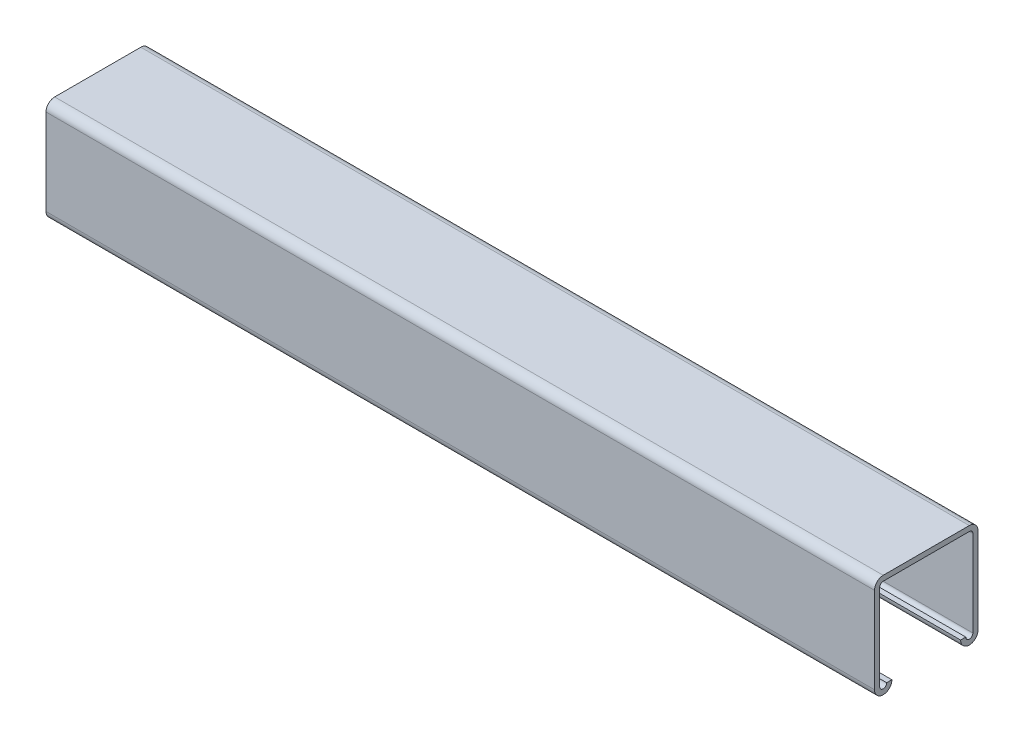
ISO-10303-21;
HEADER;
FILE_DESCRIPTION(('STEP AP214'),'2;1');
FILE_NAME('part.step','',(''),(''),'','','');
FILE_SCHEMA(('AUTOMOTIVE_DESIGN { 1 0 10303 214 1 1 1 1 }'));
ENDSEC;
DATA;
#1=APPLICATION_CONTEXT('core data for automotive mechanical design processes');
#2=APPLICATION_PROTOCOL_DEFINITION('international standard','automotive_design',2000,#1);
#3=PRODUCT_CONTEXT('',#1,'mechanical');
#4=PRODUCT('Part','Part','',(#3));
#5=PRODUCT_RELATED_PRODUCT_CATEGORY('part','',(#4));
#6=PRODUCT_DEFINITION_FORMATION('','',#4);
#7=PRODUCT_DEFINITION_CONTEXT('part definition',#1,'design');
#8=PRODUCT_DEFINITION('design','',#6,#7);
#9=PRODUCT_DEFINITION_SHAPE('','',#8);
#10=(LENGTH_UNIT() NAMED_UNIT(*) SI_UNIT(.MILLI.,.METRE.));
#11=(NAMED_UNIT(*) PLANE_ANGLE_UNIT() SI_UNIT($,.RADIAN.));
#12=(NAMED_UNIT(*) SI_UNIT($,.STERADIAN.) SOLID_ANGLE_UNIT());
#13=UNCERTAINTY_MEASURE_WITH_UNIT(LENGTH_MEASURE(1.E-05),#10,'distance_accuracy_value','');
#14=(GEOMETRIC_REPRESENTATION_CONTEXT(3) GLOBAL_UNCERTAINTY_ASSIGNED_CONTEXT((#13)) GLOBAL_UNIT_ASSIGNED_CONTEXT((#10,
#11,#12)) REPRESENTATION_CONTEXT('',''));
#15=CARTESIAN_POINT('',(0.,0.,0.));
#16=DIRECTION('',(0.,0.,1.));
#17=DIRECTION('',(1.,0.,0.));
#18=AXIS2_PLACEMENT_3D('',#15,#16,#17);
#19=CARTESIAN_POINT('',(305.,-34.9,-15.85));
#20=DIRECTION('',(-1.,0.,0.));
#21=DIRECTION('',(0.,0.,1.));
#22=AXIS2_PLACEMENT_3D('',#19,#20,#21);
#23=CYLINDRICAL_SURFACE('',#22,1.3);
#24=CARTESIAN_POINT('',(0.,-34.9,-15.85));
#25=DIRECTION('',(1.,0.,0.));
#26=DIRECTION('',(0.,0.,1.));
#27=AXIS2_PLACEMENT_3D('',#24,#25,#26);
#28=CIRCLE('',#27,1.3);
#29=CARTESIAN_POINT('',(0.,-34.9,-17.15));
#30=VERTEX_POINT('',#29);
#31=CARTESIAN_POINT('',(0.,-34.9,-14.55));
#32=VERTEX_POINT('',#31);
#33=EDGE_CURVE('E176',#30,#32,#28,.F.);
#34=ORIENTED_EDGE('',*,*,#33,.T.);
#35=DIRECTION('',(-1.,0.,0.));
#36=VECTOR('',#35,1.);
#37=CARTESIAN_POINT('',(305.,-34.9,-14.55));
#38=LINE('',#37,#36);
#39=CARTESIAN_POINT('',(305.,-34.9,-14.55));
#40=VERTEX_POINT('',#39);
#41=EDGE_CURVE('E11',#40,#32,#38,.T.);
#42=ORIENTED_EDGE('',*,*,#41,.F.);
#43=CARTESIAN_POINT('',(305.,-34.9,-15.85));
#44=DIRECTION('',(1.,0.,0.));
#45=DIRECTION('',(0.,0.,1.));
#46=AXIS2_PLACEMENT_3D('',#43,#44,#45);
#47=CIRCLE('',#46,1.3);
#48=CARTESIAN_POINT('',(305.,-34.9,-17.15));
#49=VERTEX_POINT('',#48);
#50=EDGE_CURVE('E113',#49,#40,#47,.F.);
#51=ORIENTED_EDGE('',*,*,#50,.F.);
#52=DIRECTION('',(-1.,0.,0.));
#53=VECTOR('',#52,1.);
#54=CARTESIAN_POINT('',(305.,-34.9,-17.15));
#55=LINE('',#54,#53);
#56=EDGE_CURVE('E172',#49,#30,#55,.T.);
#57=ORIENTED_EDGE('',*,*,#56,.T.);
#58=EDGE_LOOP('',(#34,#42,#51,#57));
#59=FACE_BOUND('',#58,.T.);
#60=ADVANCED_FACE('F33',(#59),#23,.F.);
#61=CARTESIAN_POINT('',(305.,-34.9,-12.65));
#62=DIRECTION('',(0.,1.,0.));
#63=DIRECTION('',(0.,0.,1.));
#64=AXIS2_PLACEMENT_3D('',#61,#62,#63);
#65=PLANE('',#64);
#66=DIRECTION('',(0.,0.,-1.));
#67=VECTOR('',#66,1.);
#68=CARTESIAN_POINT('',(0.,-34.9,-12.65));
#69=LINE('',#68,#67);
#70=CARTESIAN_POINT('',(0.,-34.9,-12.65));
#71=VERTEX_POINT('',#70);
#72=EDGE_CURVE('E179',#71,#32,#69,.T.);
#73=ORIENTED_EDGE('',*,*,#72,.F.);
#74=DIRECTION('',(-1.,0.,0.));
#75=VECTOR('',#74,1.);
#76=CARTESIAN_POINT('',(305.,-34.9,-12.65));
#77=LINE('',#76,#75);
#78=CARTESIAN_POINT('',(305.,-34.9,-12.65));
#79=VERTEX_POINT('',#78);
#80=EDGE_CURVE('E41',#79,#71,#77,.T.);
#81=ORIENTED_EDGE('',*,*,#80,.F.);
#82=DIRECTION('',(0.,0.,-1.));
#83=VECTOR('',#82,1.);
#84=CARTESIAN_POINT('',(305.,-34.9,-12.65));
#85=LINE('',#84,#83);
#86=EDGE_CURVE('E261',#79,#40,#85,.T.);
#87=ORIENTED_EDGE('',*,*,#86,.T.);
#88=ORIENTED_EDGE('',*,*,#41,.T.);
#89=EDGE_LOOP('',(#73,#81,#87,#88));
#90=FACE_BOUND('',#89,.T.);
#91=ADVANCED_FACE('F248',(#90),#65,.T.);
#92=CARTESIAN_POINT('',(305.,-34.9,-15.85));
#93=DIRECTION('',(-1.,0.,0.));
#94=DIRECTION('',(0.,0.,1.));
#95=AXIS2_PLACEMENT_3D('',#92,#93,#94);
#96=CYLINDRICAL_SURFACE('',#95,3.2);
#97=CARTESIAN_POINT('',(0.,-34.9,-15.85));
#98=DIRECTION('',(-1.,0.,0.));
#99=DIRECTION('',(0.,0.,1.));
#100=AXIS2_PLACEMENT_3D('',#97,#98,#99);
#101=CIRCLE('',#100,3.2);
#102=CARTESIAN_POINT('',(0.,-34.9,-19.05));
#103=VERTEX_POINT('',#102);
#104=EDGE_CURVE('E182',#103,#71,#101,.T.);
#105=ORIENTED_EDGE('',*,*,#104,.F.);
#106=DIRECTION('',(-1.,0.,0.));
#107=VECTOR('',#106,1.);
#108=CARTESIAN_POINT('',(305.,-34.9,-19.05));
#109=LINE('',#108,#107);
#110=CARTESIAN_POINT('',(305.,-34.9,-19.05));
#111=VERTEX_POINT('',#110);
#112=EDGE_CURVE('E238',#111,#103,#109,.T.);
#113=ORIENTED_EDGE('',*,*,#112,.F.);
#114=CARTESIAN_POINT('',(305.,-34.9,-15.85));
#115=DIRECTION('',(-1.,0.,0.));
#116=DIRECTION('',(0.,0.,1.));
#117=AXIS2_PLACEMENT_3D('',#114,#115,#116);
#118=CIRCLE('',#117,3.2);
#119=EDGE_CURVE('E245',#111,#79,#118,.T.);
#120=ORIENTED_EDGE('',*,*,#119,.T.);
#121=ORIENTED_EDGE('',*,*,#80,.T.);
#122=EDGE_LOOP('',(#105,#113,#120,#121));
#123=FACE_BOUND('',#122,.T.);
#124=ADVANCED_FACE('F243',(#123),#96,.T.);
#125=CARTESIAN_POINT('',(305.,-3.2,-19.05));
#126=DIRECTION('',(0.,0.,-1.));
#127=DIRECTION('',(0.,1.,0.));
#128=AXIS2_PLACEMENT_3D('',#125,#126,#127);
#129=PLANE('',#128);
#130=DIRECTION('',(0.,-1.,0.));
#131=VECTOR('',#130,1.);
#132=CARTESIAN_POINT('',(0.,-3.2,-19.05));
#133=LINE('',#132,#131);
#134=CARTESIAN_POINT('',(0.,-3.2,-19.0499999999999));
#135=VERTEX_POINT('',#134);
#136=EDGE_CURVE('E185',#135,#103,#133,.T.);
#137=ORIENTED_EDGE('',*,*,#136,.F.);
#138=DIRECTION('',(-1.,0.,0.));
#139=VECTOR('',#138,1.);
#140=CARTESIAN_POINT('',(305.,-3.2,-19.0499999999999));
#141=LINE('',#140,#139);
#142=CARTESIAN_POINT('',(305.,-3.2,-19.0499999999999));
#143=VERTEX_POINT('',#142);
#144=EDGE_CURVE('E236',#143,#135,#141,.T.);
#145=ORIENTED_EDGE('',*,*,#144,.F.);
#146=DIRECTION('',(0.,-1.,0.));
#147=VECTOR('',#146,1.);
#148=CARTESIAN_POINT('',(305.,-3.2,-19.05));
#149=LINE('',#148,#147);
#150=EDGE_CURVE('E258',#143,#111,#149,.T.);
#151=ORIENTED_EDGE('',*,*,#150,.T.);
#152=ORIENTED_EDGE('',*,*,#112,.T.);
#153=EDGE_LOOP('',(#137,#145,#151,#152));
#154=FACE_BOUND('',#153,.T.);
#155=ADVANCED_FACE('F255',(#154),#129,.T.);
#156=CARTESIAN_POINT('',(305.,-3.2,-15.8499999999997));
#157=DIRECTION('',(-1.,0.,0.));
#158=DIRECTION('',(0.,0.,1.));
#159=AXIS2_PLACEMENT_3D('',#156,#157,#158);
#160=CYLINDRICAL_SURFACE('',#159,3.20000000000014);
#161=CARTESIAN_POINT('',(0.,-3.2,-15.8499999999997));
#162=DIRECTION('',(-1.,0.,0.));
#163=DIRECTION('',(0.,0.,1.));
#164=AXIS2_PLACEMENT_3D('',#161,#162,#163);
#165=CIRCLE('',#164,3.20000000000014);
#166=CARTESIAN_POINT('',(0.,0.,-15.8499999999997));
#167=VERTEX_POINT('',#166);
#168=EDGE_CURVE('E188',#167,#135,#165,.T.);
#169=ORIENTED_EDGE('',*,*,#168,.F.);
#170=DIRECTION('',(-1.,0.,0.));
#171=VECTOR('',#170,1.);
#172=CARTESIAN_POINT('',(305.,0.,-15.8499999999997));
#173=LINE('',#172,#171);
#174=CARTESIAN_POINT('',(305.,0.,-15.8499999999997));
#175=VERTEX_POINT('',#174);
#176=EDGE_CURVE('E234',#175,#167,#173,.T.);
#177=ORIENTED_EDGE('',*,*,#176,.F.);
#178=CARTESIAN_POINT('',(305.,-3.2,-15.8499999999997));
#179=DIRECTION('',(-1.,0.,0.));
#180=DIRECTION('',(0.,0.,1.));
#181=AXIS2_PLACEMENT_3D('',#178,#179,#180);
#182=CIRCLE('',#181,3.20000000000014);
#183=EDGE_CURVE('E263',#175,#143,#182,.T.);
#184=ORIENTED_EDGE('',*,*,#183,.T.);
#185=ORIENTED_EDGE('',*,*,#144,.T.);
#186=EDGE_LOOP('',(#169,#177,#184,#185));
#187=FACE_BOUND('',#186,.T.);
#188=ADVANCED_FACE('F320',(#187),#160,.T.);
#189=CARTESIAN_POINT('',(305.,0.,-15.8499999999997));
#190=DIRECTION('',(0.,1.,0.));
#191=DIRECTION('',(0.,0.,1.));
#192=AXIS2_PLACEMENT_3D('',#189,#190,#191);
#193=PLANE('',#192);
#194=DIRECTION('',(0.,0.,-1.));
#195=VECTOR('',#194,1.);
#196=CARTESIAN_POINT('',(0.,0.,-15.8499999999997));
#197=LINE('',#196,#195);
#198=CARTESIAN_POINT('',(0.,1.31838984174237E-13,15.85));
#199=VERTEX_POINT('',#198);
#200=EDGE_CURVE('E191',#199,#167,#197,.T.);
#201=ORIENTED_EDGE('',*,*,#200,.F.);
#202=DIRECTION('',(-1.,0.,0.));
#203=VECTOR('',#202,1.);
#204=CARTESIAN_POINT('',(305.,1.31838984174237E-13,15.85));
#205=LINE('',#204,#203);
#206=CARTESIAN_POINT('',(305.,1.31838984174237E-13,15.85));
#207=VERTEX_POINT('',#206);
#208=EDGE_CURVE('E232',#207,#199,#205,.T.);
#209=ORIENTED_EDGE('',*,*,#208,.F.);
#210=DIRECTION('',(0.,0.,-1.));
#211=VECTOR('',#210,1.);
#212=CARTESIAN_POINT('',(305.,0.,-15.8499999999997));
#213=LINE('',#212,#211);
#214=EDGE_CURVE('E269',#207,#175,#213,.T.);
#215=ORIENTED_EDGE('',*,*,#214,.T.);
#216=ORIENTED_EDGE('',*,*,#176,.T.);
#217=EDGE_LOOP('',(#201,#209,#215,#216));
#218=FACE_BOUND('',#217,.T.);
#219=ADVANCED_FACE('F323',(#218),#193,.T.);
#220=CARTESIAN_POINT('',(305.,-3.2,15.85));
#221=DIRECTION('',(-1.,0.,0.));
#222=DIRECTION('',(0.,0.,1.));
#223=AXIS2_PLACEMENT_3D('',#220,#221,#222);
#224=CYLINDRICAL_SURFACE('',#223,3.20000000000014);
#225=CARTESIAN_POINT('',(0.,-3.2,15.85));
#226=DIRECTION('',(-1.,0.,0.));
#227=DIRECTION('',(0.,0.,-1.));
#228=AXIS2_PLACEMENT_3D('',#225,#226,#227);
#229=CIRCLE('',#228,3.20000000000014);
#230=CARTESIAN_POINT('',(0.,-3.2,19.0500000000003));
#231=VERTEX_POINT('',#230);
#232=EDGE_CURVE('E194',#231,#199,#229,.T.);
#233=ORIENTED_EDGE('',*,*,#232,.F.);
#234=DIRECTION('',(-1.,0.,0.));
#235=VECTOR('',#234,1.);
#236=CARTESIAN_POINT('',(305.,-3.2,19.0500000000003));
#237=LINE('',#236,#235);
#238=CARTESIAN_POINT('',(305.,-3.2,19.0500000000003));
#239=VERTEX_POINT('',#238);
#240=EDGE_CURVE('E230',#239,#231,#237,.T.);
#241=ORIENTED_EDGE('',*,*,#240,.F.);
#242=CARTESIAN_POINT('',(305.,-3.2,15.85));
#243=DIRECTION('',(-1.,0.,0.));
#244=DIRECTION('',(0.,0.,-1.));
#245=AXIS2_PLACEMENT_3D('',#242,#243,#244);
#246=CIRCLE('',#245,3.20000000000014);
#247=EDGE_CURVE('E272',#239,#207,#246,.T.);
#248=ORIENTED_EDGE('',*,*,#247,.T.);
#249=ORIENTED_EDGE('',*,*,#208,.T.);
#250=EDGE_LOOP('',(#233,#241,#248,#249));
#251=FACE_BOUND('',#250,.T.);
#252=ADVANCED_FACE('F327',(#251),#224,.T.);
#253=CARTESIAN_POINT('',(305.,-3.2,19.0500000000003));
#254=DIRECTION('',(0.,0.,1.));
#255=DIRECTION('',(0.,-1.,0.));
#256=AXIS2_PLACEMENT_3D('',#253,#254,#255);
#257=PLANE('',#256);
#258=DIRECTION('',(0.,1.,0.));
#259=VECTOR('',#258,1.);
#260=CARTESIAN_POINT('',(0.,-3.2,19.0500000000003));
#261=LINE('',#260,#259);
#262=CARTESIAN_POINT('',(0.,-34.9,19.0500000000001));
#263=VERTEX_POINT('',#262);
#264=EDGE_CURVE('E197',#263,#231,#261,.T.);
#265=ORIENTED_EDGE('',*,*,#264,.F.);
#266=DIRECTION('',(-1.,0.,0.));
#267=VECTOR('',#266,1.);
#268=CARTESIAN_POINT('',(305.,-34.9,19.0500000000001));
#269=LINE('',#268,#267);
#270=CARTESIAN_POINT('',(305.,-34.9,19.0500000000001));
#271=VERTEX_POINT('',#270);
#272=EDGE_CURVE('E228',#271,#263,#269,.T.);
#273=ORIENTED_EDGE('',*,*,#272,.F.);
#274=DIRECTION('',(0.,1.,0.));
#275=VECTOR('',#274,1.);
#276=CARTESIAN_POINT('',(305.,-3.2,19.0500000000003));
#277=LINE('',#276,#275);
#278=EDGE_CURVE('E275',#271,#239,#277,.T.);
#279=ORIENTED_EDGE('',*,*,#278,.T.);
#280=ORIENTED_EDGE('',*,*,#240,.T.);
#281=EDGE_LOOP('',(#265,#273,#279,#280));
#282=FACE_BOUND('',#281,.T.);
#283=ADVANCED_FACE('F331',(#282),#257,.T.);
#284=CARTESIAN_POINT('',(305.,-34.9,15.85));
#285=DIRECTION('',(-1.,0.,0.));
#286=DIRECTION('',(0.,0.,1.));
#287=AXIS2_PLACEMENT_3D('',#284,#285,#286);
#288=CYLINDRICAL_SURFACE('',#287,3.20000000000014);
#289=CARTESIAN_POINT('',(0.,-34.9,15.85));
#290=DIRECTION('',(-1.,0.,0.));
#291=DIRECTION('',(0.,0.,-1.));
#292=AXIS2_PLACEMENT_3D('',#289,#290,#291);
#293=CIRCLE('',#292,3.20000000000014);
#294=CARTESIAN_POINT('',(0.,-34.9,12.6499999999999));
#295=VERTEX_POINT('',#294);
#296=EDGE_CURVE('E200',#295,#263,#293,.T.);
#297=ORIENTED_EDGE('',*,*,#296,.F.);
#298=DIRECTION('',(-1.,0.,0.));
#299=VECTOR('',#298,1.);
#300=CARTESIAN_POINT('',(305.,-34.9,12.6499999999999));
#301=LINE('',#300,#299);
#302=CARTESIAN_POINT('',(305.,-34.9,12.6499999999999));
#303=VERTEX_POINT('',#302);
#304=EDGE_CURVE('E226',#303,#295,#301,.T.);
#305=ORIENTED_EDGE('',*,*,#304,.F.);
#306=CARTESIAN_POINT('',(305.,-34.9,15.85));
#307=DIRECTION('',(-1.,0.,0.));
#308=DIRECTION('',(0.,0.,-1.));
#309=AXIS2_PLACEMENT_3D('',#306,#307,#308);
#310=CIRCLE('',#309,3.20000000000014);
#311=EDGE_CURVE('E278',#303,#271,#310,.T.);
#312=ORIENTED_EDGE('',*,*,#311,.T.);
#313=ORIENTED_EDGE('',*,*,#272,.T.);
#314=EDGE_LOOP('',(#297,#305,#312,#313));
#315=FACE_BOUND('',#314,.T.);
#316=ADVANCED_FACE('F335',(#315),#288,.T.);
#317=CARTESIAN_POINT('',(305.,-34.9,14.5499999999999));
#318=DIRECTION('',(0.,1.,0.));
#319=DIRECTION('',(0.,0.,1.));
#320=AXIS2_PLACEMENT_3D('',#317,#318,#319);
#321=PLANE('',#320);
#322=DIRECTION('',(0.,0.,-1.));
#323=VECTOR('',#322,1.);
#324=CARTESIAN_POINT('',(0.,-34.9,14.5499999999999));
#325=LINE('',#324,#323);
#326=CARTESIAN_POINT('',(0.,-34.9,14.5499999999999));
#327=VERTEX_POINT('',#326);
#328=EDGE_CURVE('E203',#327,#295,#325,.T.);
#329=ORIENTED_EDGE('',*,*,#328,.F.);
#330=DIRECTION('',(-1.,0.,0.));
#331=VECTOR('',#330,1.);
#332=CARTESIAN_POINT('',(305.,-34.9,14.5499999999999));
#333=LINE('',#332,#331);
#334=CARTESIAN_POINT('',(305.,-34.9,14.5499999999999));
#335=VERTEX_POINT('',#334);
#336=EDGE_CURVE('E224',#335,#327,#333,.T.);
#337=ORIENTED_EDGE('',*,*,#336,.F.);
#338=DIRECTION('',(0.,0.,-1.));
#339=VECTOR('',#338,1.);
#340=CARTESIAN_POINT('',(305.,-34.9,14.5499999999999));
#341=LINE('',#340,#339);
#342=EDGE_CURVE('E281',#335,#303,#341,.T.);
#343=ORIENTED_EDGE('',*,*,#342,.T.);
#344=ORIENTED_EDGE('',*,*,#304,.T.);
#345=EDGE_LOOP('',(#329,#337,#343,#344));
#346=FACE_BOUND('',#345,.T.);
#347=ADVANCED_FACE('F339',(#346),#321,.T.);
#348=CARTESIAN_POINT('',(305.,-34.9,15.85));
#349=DIRECTION('',(-1.,0.,0.));
#350=DIRECTION('',(0.,0.,1.));
#351=AXIS2_PLACEMENT_3D('',#348,#349,#350);
#352=CYLINDRICAL_SURFACE('',#351,1.30000000000014);
#353=CARTESIAN_POINT('',(0.,-34.9,15.85));
#354=DIRECTION('',(1.,0.,0.));
#355=DIRECTION('',(0.,0.,1.));
#356=AXIS2_PLACEMENT_3D('',#353,#354,#355);
#357=CIRCLE('',#356,1.30000000000014);
#358=CARTESIAN_POINT('',(0.,-34.9,17.1500000000003));
#359=VERTEX_POINT('',#358);
#360=EDGE_CURVE('E206',#327,#359,#357,.F.);
#361=ORIENTED_EDGE('',*,*,#360,.T.);
#362=DIRECTION('',(-1.,0.,0.));
#363=VECTOR('',#362,1.);
#364=CARTESIAN_POINT('',(305.,-34.9,17.1500000000003));
#365=LINE('',#364,#363);
#366=CARTESIAN_POINT('',(305.,-34.9,17.1500000000003));
#367=VERTEX_POINT('',#366);
#368=EDGE_CURVE('E221',#367,#359,#365,.T.);
#369=ORIENTED_EDGE('',*,*,#368,.F.);
#370=CARTESIAN_POINT('',(305.,-34.9,15.85));
#371=DIRECTION('',(1.,0.,0.));
#372=DIRECTION('',(0.,0.,1.));
#373=AXIS2_PLACEMENT_3D('',#370,#371,#372);
#374=CIRCLE('',#373,1.30000000000014);
#375=EDGE_CURVE('E284',#335,#367,#374,.F.);
#376=ORIENTED_EDGE('',*,*,#375,.F.);
#377=ORIENTED_EDGE('',*,*,#336,.T.);
#378=EDGE_LOOP('',(#361,#369,#376,#377));
#379=FACE_BOUND('',#378,.T.);
#380=ADVANCED_FACE('F343',(#379),#352,.F.);
#381=CARTESIAN_POINT('',(305.,-3.2,17.1500000000003));
#382=DIRECTION('',(0.,0.,1.));
#383=DIRECTION('',(0.,-1.,0.));
#384=AXIS2_PLACEMENT_3D('',#381,#382,#383);
#385=PLANE('',#384);
#386=DIRECTION('',(0.,1.,0.));
#387=VECTOR('',#386,1.);
#388=CARTESIAN_POINT('',(0.,-3.2,17.1500000000003));
#389=LINE('',#388,#387);
#390=CARTESIAN_POINT('',(0.,-3.2,17.1500000000001));
#391=VERTEX_POINT('',#390);
#392=EDGE_CURVE('E208',#359,#391,#389,.T.);
#393=ORIENTED_EDGE('',*,*,#392,.T.);
#394=DIRECTION('',(-1.,0.,0.));
#395=VECTOR('',#394,1.);
#396=CARTESIAN_POINT('',(305.,-3.2,17.1500000000001));
#397=LINE('',#396,#395);
#398=CARTESIAN_POINT('',(305.,-3.2,17.1500000000001));
#399=VERTEX_POINT('',#398);
#400=EDGE_CURVE('E218',#399,#391,#397,.T.);
#401=ORIENTED_EDGE('',*,*,#400,.F.);
#402=DIRECTION('',(0.,1.,0.));
#403=VECTOR('',#402,1.);
#404=CARTESIAN_POINT('',(305.,-3.2,17.1500000000003));
#405=LINE('',#404,#403);
#406=EDGE_CURVE('E286',#367,#399,#405,.T.);
#407=ORIENTED_EDGE('',*,*,#406,.F.);
#408=ORIENTED_EDGE('',*,*,#368,.T.);
#409=EDGE_LOOP('',(#393,#401,#407,#408));
#410=FACE_BOUND('',#409,.T.);
#411=ADVANCED_FACE('F293',(#410),#385,.F.);
#412=CARTESIAN_POINT('',(305.,-3.2,15.85));
#413=DIRECTION('',(-1.,0.,0.));
#414=DIRECTION('',(0.,0.,1.));
#415=AXIS2_PLACEMENT_3D('',#412,#413,#414);
#416=CYLINDRICAL_SURFACE('',#415,1.30000000000014);
#417=CARTESIAN_POINT('',(0.,-3.2,15.85));
#418=DIRECTION('',(1.,0.,0.));
#419=DIRECTION('',(0.,0.,1.));
#420=AXIS2_PLACEMENT_3D('',#417,#418,#419);
#421=CIRCLE('',#420,1.30000000000014);
#422=CARTESIAN_POINT('',(0.,-1.9,15.85));
#423=VERTEX_POINT('',#422);
#424=EDGE_CURVE('E210',#391,#423,#421,.F.);
#425=ORIENTED_EDGE('',*,*,#424,.T.);
#426=DIRECTION('',(-1.,0.,0.));
#427=VECTOR('',#426,1.);
#428=CARTESIAN_POINT('',(305.,-1.9,15.85));
#429=LINE('',#428,#427);
#430=CARTESIAN_POINT('',(305.,-1.9,15.85));
#431=VERTEX_POINT('',#430);
#432=EDGE_CURVE('E167',#431,#423,#429,.T.);
#433=ORIENTED_EDGE('',*,*,#432,.F.);
#434=CARTESIAN_POINT('',(305.,-3.2,15.85));
#435=DIRECTION('',(1.,0.,0.));
#436=DIRECTION('',(0.,0.,1.));
#437=AXIS2_PLACEMENT_3D('',#434,#435,#436);
#438=CIRCLE('',#437,1.30000000000014);
#439=EDGE_CURVE('E158',#399,#431,#438,.F.);
#440=ORIENTED_EDGE('',*,*,#439,.F.);
#441=ORIENTED_EDGE('',*,*,#400,.T.);
#442=EDGE_LOOP('',(#425,#433,#440,#441));
#443=FACE_BOUND('',#442,.T.);
#444=ADVANCED_FACE('F297',(#443),#416,.F.);
#445=CARTESIAN_POINT('',(305.,-1.9,-15.8499999999997));
#446=DIRECTION('',(0.,1.,0.));
#447=DIRECTION('',(0.,0.,1.));
#448=AXIS2_PLACEMENT_3D('',#445,#446,#447);
#449=PLANE('',#448);
#450=DIRECTION('',(0.,0.,1.));
#451=VECTOR('',#450,1.);
#452=CARTESIAN_POINT('',(0.,-1.9,-15.8499999999997));
#453=LINE('',#452,#451);
#454=CARTESIAN_POINT('',(0.,-1.89999999999987,-15.8499999999997));
#455=VERTEX_POINT('',#454);
#456=EDGE_CURVE('E166',#423,#455,#453,.F.);
#457=ORIENTED_EDGE('',*,*,#456,.T.);
#458=DIRECTION('',(-1.,0.,0.));
#459=VECTOR('',#458,1.);
#460=CARTESIAN_POINT('',(305.,-1.89999999999987,-15.8499999999997));
#461=LINE('',#460,#459);
#462=CARTESIAN_POINT('',(305.,-1.89999999999987,-15.8499999999997));
#463=VERTEX_POINT('',#462);
#464=EDGE_CURVE('E163',#463,#455,#461,.T.);
#465=ORIENTED_EDGE('',*,*,#464,.F.);
#466=DIRECTION('',(0.,0.,1.));
#467=VECTOR('',#466,1.);
#468=CARTESIAN_POINT('',(305.,-1.9,-15.8499999999997));
#469=LINE('',#468,#467);
#470=EDGE_CURVE('E152',#431,#463,#469,.F.);
#471=ORIENTED_EDGE('',*,*,#470,.F.);
#472=ORIENTED_EDGE('',*,*,#432,.T.);
#473=EDGE_LOOP('',(#457,#465,#471,#472));
#474=FACE_BOUND('',#473,.T.);
#475=ADVANCED_FACE('F164',(#474),#449,.F.);
#476=CARTESIAN_POINT('',(305.,-3.2,-15.8499999999997));
#477=DIRECTION('',(-1.,0.,0.));
#478=DIRECTION('',(0.,0.,1.));
#479=AXIS2_PLACEMENT_3D('',#476,#477,#478);
#480=CYLINDRICAL_SURFACE('',#479,1.30000000000014);
#481=CARTESIAN_POINT('',(0.,-3.2,-15.8499999999997));
#482=DIRECTION('',(1.,0.,0.));
#483=DIRECTION('',(0.,0.,1.));
#484=AXIS2_PLACEMENT_3D('',#481,#482,#483);
#485=CIRCLE('',#484,1.30000000000014);
#486=CARTESIAN_POINT('',(0.,-3.2,-17.15));
#487=VERTEX_POINT('',#486);
#488=EDGE_CURVE('E101',#455,#487,#485,.F.);
#489=ORIENTED_EDGE('',*,*,#488,.T.);
#490=DIRECTION('',(-1.,0.,0.));
#491=VECTOR('',#490,1.);
#492=CARTESIAN_POINT('',(305.,-3.2,-17.15));
#493=LINE('',#492,#491);
#494=CARTESIAN_POINT('',(305.,-3.2,-17.15));
#495=VERTEX_POINT('',#494);
#496=EDGE_CURVE('E168',#495,#487,#493,.T.);
#497=ORIENTED_EDGE('',*,*,#496,.F.);
#498=CARTESIAN_POINT('',(305.,-3.2,-15.8499999999997));
#499=DIRECTION('',(1.,0.,0.));
#500=DIRECTION('',(0.,0.,1.));
#501=AXIS2_PLACEMENT_3D('',#498,#499,#500);
#502=CIRCLE('',#501,1.30000000000014);
#503=EDGE_CURVE('E156',#463,#495,#502,.F.);
#504=ORIENTED_EDGE('',*,*,#503,.F.);
#505=ORIENTED_EDGE('',*,*,#464,.T.);
#506=EDGE_LOOP('',(#489,#497,#504,#505));
#507=FACE_BOUND('',#506,.T.);
#508=ADVANCED_FACE('F170',(#507),#480,.F.);
#509=CARTESIAN_POINT('',(305.,-3.2,-17.15));
#510=DIRECTION('',(0.,0.,-1.));
#511=DIRECTION('',(0.,1.,0.));
#512=AXIS2_PLACEMENT_3D('',#509,#510,#511);
#513=PLANE('',#512);
#514=DIRECTION('',(0.,-1.,0.));
#515=VECTOR('',#514,1.);
#516=CARTESIAN_POINT('',(0.,-3.2,-17.15));
#517=LINE('',#516,#515);
#518=EDGE_CURVE('E107',#487,#30,#517,.T.);
#519=ORIENTED_EDGE('',*,*,#518,.T.);
#520=ORIENTED_EDGE('',*,*,#56,.F.);
#521=DIRECTION('',(0.,-1.,0.));
#522=VECTOR('',#521,1.);
#523=CARTESIAN_POINT('',(305.,-3.2,-17.15));
#524=LINE('',#523,#522);
#525=EDGE_CURVE('E49',#495,#49,#524,.T.);
#526=ORIENTED_EDGE('',*,*,#525,.F.);
#527=ORIENTED_EDGE('',*,*,#496,.T.);
#528=EDGE_LOOP('',(#519,#520,#526,#527));
#529=FACE_BOUND('',#528,.T.);
#530=ADVANCED_FACE('F299',(#529),#513,.F.);
#531=CARTESIAN_POINT('',(305.,-34.9,-15.85));
#532=DIRECTION('',(1.,0.,0.));
#533=DIRECTION('',(0.,0.,1.));
#534=AXIS2_PLACEMENT_3D('',#531,#532,#533);
#535=PLANE('',#534);
#536=ORIENTED_EDGE('',*,*,#50,.T.);
#537=ORIENTED_EDGE('',*,*,#86,.F.);
#538=ORIENTED_EDGE('',*,*,#119,.F.);
#539=ORIENTED_EDGE('',*,*,#150,.F.);
#540=ORIENTED_EDGE('',*,*,#183,.F.);
#541=ORIENTED_EDGE('',*,*,#214,.F.);
#542=ORIENTED_EDGE('',*,*,#247,.F.);
#543=ORIENTED_EDGE('',*,*,#278,.F.);
#544=ORIENTED_EDGE('',*,*,#311,.F.);
#545=ORIENTED_EDGE('',*,*,#342,.F.);
#546=ORIENTED_EDGE('',*,*,#375,.T.);
#547=ORIENTED_EDGE('',*,*,#406,.T.);
#548=ORIENTED_EDGE('',*,*,#439,.T.);
#549=ORIENTED_EDGE('',*,*,#470,.T.);
#550=ORIENTED_EDGE('',*,*,#503,.T.);
#551=ORIENTED_EDGE('',*,*,#525,.T.);
#552=EDGE_LOOP('',(#536,#537,#538,#539,#540,#541,#542,#543,#544,#545,#546,#547,#548,#549,#550,#551));
#553=FACE_BOUND('',#552,.T.);
#554=ADVANCED_FACE('F154',(#553),#535,.T.);
#555=CARTESIAN_POINT('',(0.,-34.9,-15.85));
#556=DIRECTION('',(1.,0.,0.));
#557=DIRECTION('',(0.,0.,1.));
#558=AXIS2_PLACEMENT_3D('',#555,#556,#557);
#559=PLANE('',#558);
#560=ORIENTED_EDGE('',*,*,#33,.F.);
#561=ORIENTED_EDGE('',*,*,#518,.F.);
#562=ORIENTED_EDGE('',*,*,#488,.F.);
#563=ORIENTED_EDGE('',*,*,#456,.F.);
#564=ORIENTED_EDGE('',*,*,#424,.F.);
#565=ORIENTED_EDGE('',*,*,#392,.F.);
#566=ORIENTED_EDGE('',*,*,#360,.F.);
#567=ORIENTED_EDGE('',*,*,#328,.T.);
#568=ORIENTED_EDGE('',*,*,#296,.T.);
#569=ORIENTED_EDGE('',*,*,#264,.T.);
#570=ORIENTED_EDGE('',*,*,#232,.T.);
#571=ORIENTED_EDGE('',*,*,#200,.T.);
#572=ORIENTED_EDGE('',*,*,#168,.T.);
#573=ORIENTED_EDGE('',*,*,#136,.T.);
#574=ORIENTED_EDGE('',*,*,#104,.T.);
#575=ORIENTED_EDGE('',*,*,#72,.T.);
#576=EDGE_LOOP('',(#560,#561,#562,#563,#564,#565,#566,#567,#568,#569,#570,#571,#572,#573,#574,#575));
#577=FACE_BOUND('',#576,.T.);
#578=ADVANCED_FACE('F251',(#577),#559,.F.);
#579=CLOSED_SHELL('',(#60,#91,#124,#155,#188,#219,#252,#283,#316,#347,#380,#411,#444,#475,#508,
#530,#554,#578));
#580=MANIFOLD_SOLID_BREP('B2',#579);
#581=ADVANCED_BREP_SHAPE_REPRESENTATION('',(#18,#580),#14);
#582=SHAPE_DEFINITION_REPRESENTATION(#9,#581);
ENDSEC;
END-ISO-10303-21;
